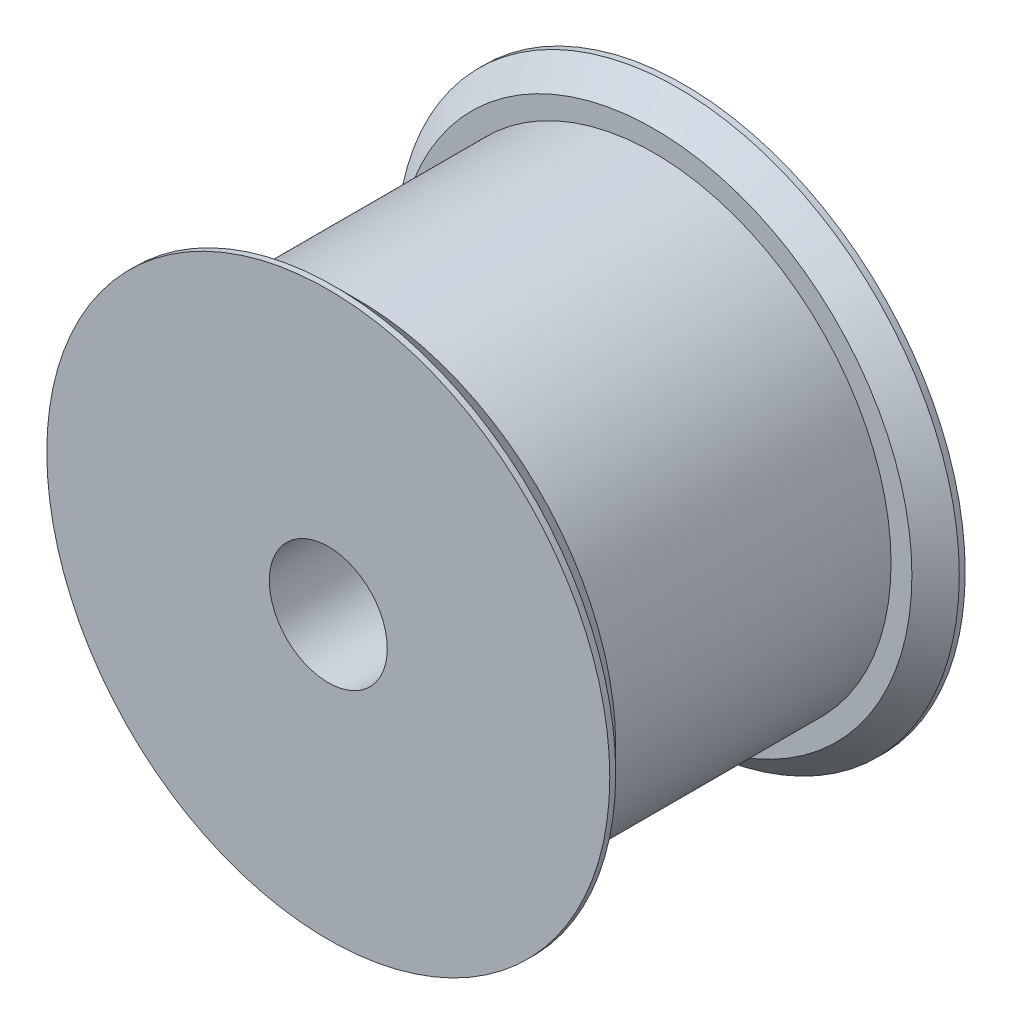
ISO-10303-21;
HEADER;
FILE_DESCRIPTION(('STEP AP214'),'2;1');
FILE_NAME('part.step','',(''),(''),'','','');
FILE_SCHEMA(('AUTOMOTIVE_DESIGN { 1 0 10303 214 1 1 1 1 }'));
ENDSEC;
DATA;
#1=APPLICATION_CONTEXT('core data for automotive mechanical design processes');
#2=APPLICATION_PROTOCOL_DEFINITION('international standard','automotive_design',2000,#1);
#3=PRODUCT_CONTEXT('',#1,'mechanical');
#4=PRODUCT('Part','Part','',(#3));
#5=PRODUCT_RELATED_PRODUCT_CATEGORY('part','',(#4));
#6=PRODUCT_DEFINITION_FORMATION('','',#4);
#7=PRODUCT_DEFINITION_CONTEXT('part definition',#1,'design');
#8=PRODUCT_DEFINITION('design','',#6,#7);
#9=PRODUCT_DEFINITION_SHAPE('','',#8);
#10=(LENGTH_UNIT() NAMED_UNIT(*) SI_UNIT(.MILLI.,.METRE.));
#11=(NAMED_UNIT(*) PLANE_ANGLE_UNIT() SI_UNIT($,.RADIAN.));
#12=(NAMED_UNIT(*) SI_UNIT($,.STERADIAN.) SOLID_ANGLE_UNIT());
#13=UNCERTAINTY_MEASURE_WITH_UNIT(LENGTH_MEASURE(1.E-05),#10,'distance_accuracy_value','');
#14=(GEOMETRIC_REPRESENTATION_CONTEXT(3) GLOBAL_UNCERTAINTY_ASSIGNED_CONTEXT((#13)) GLOBAL_UNIT_ASSIGNED_CONTEXT((#10,
#11,#12)) REPRESENTATION_CONTEXT('',''));
#15=CARTESIAN_POINT('',(0.,0.,0.));
#16=DIRECTION('',(0.,0.,1.));
#17=DIRECTION('',(1.,0.,0.));
#18=AXIS2_PLACEMENT_3D('',#15,#16,#17);
#19=CARTESIAN_POINT('',(0.,0.,12.5));
#20=DIRECTION('',(0.,0.,-1.));
#21=DIRECTION('',(-1.,0.,0.));
#22=AXIS2_PLACEMENT_3D('',#19,#20,#21);
#23=CYLINDRICAL_SURFACE('',#22,20.);
#24=CARTESIAN_POINT('',(0.,0.,12.5));
#25=DIRECTION('',(0.,0.,1.));
#26=DIRECTION('',(1.,0.,0.));
#27=AXIS2_PLACEMENT_3D('',#24,#25,#26);
#28=CIRCLE('',#27,20.);
#29=CARTESIAN_POINT('',(20.,0.,12.5));
#30=VERTEX_POINT('',#29);
#31=EDGE_CURVE('E51',#30,#30,#28,.T.);
#32=ORIENTED_EDGE('',*,*,#31,.F.);
#33=EDGE_LOOP('',(#32));
#34=FACE_BOUND('',#33,.T.);
#35=CARTESIAN_POINT('',(0.,0.,-12.5));
#36=DIRECTION('',(0.,0.,-1.));
#37=DIRECTION('',(-1.,0.,0.));
#38=AXIS2_PLACEMENT_3D('',#35,#36,#37);
#39=CIRCLE('',#38,20.);
#40=CARTESIAN_POINT('',(-20.,0.,-12.5));
#41=VERTEX_POINT('',#40);
#42=EDGE_CURVE('E57',#41,#41,#39,.T.);
#43=ORIENTED_EDGE('',*,*,#42,.F.);
#44=EDGE_LOOP('',(#43));
#45=FACE_BOUND('',#44,.T.);
#46=ADVANCED_FACE('F31',(#34,#45),#23,.T.);
#47=CARTESIAN_POINT('',(0.,0.,15.));
#48=DIRECTION('',(0.,0.,-1.));
#49=DIRECTION('',(-1.,0.,0.));
#50=AXIS2_PLACEMENT_3D('',#47,#48,#49);
#51=CYLINDRICAL_SURFACE('',#50,23.7605625347081);
#52=CARTESIAN_POINT('',(0.,0.,14.5));
#53=DIRECTION('',(0.,0.,1.));
#54=DIRECTION('',(1.,0.,0.));
#55=AXIS2_PLACEMENT_3D('',#52,#53,#54);
#56=CIRCLE('',#55,23.7605625347081);
#57=CARTESIAN_POINT('',(23.7605625347081,0.,14.5));
#58=VERTEX_POINT('',#57);
#59=EDGE_CURVE('E46',#58,#58,#56,.T.);
#60=ORIENTED_EDGE('',*,*,#59,.T.);
#61=EDGE_LOOP('',(#60));
#62=FACE_BOUND('',#61,.T.);
#63=CARTESIAN_POINT('',(0.,0.,15.));
#64=DIRECTION('',(0.,0.,1.));
#65=DIRECTION('',(1.,0.,0.));
#66=AXIS2_PLACEMENT_3D('',#63,#64,#65);
#67=CIRCLE('',#66,23.7605625347081);
#68=CARTESIAN_POINT('',(23.7605625347081,0.,15.));
#69=VERTEX_POINT('',#68);
#70=EDGE_CURVE('E54',#69,#69,#67,.T.);
#71=ORIENTED_EDGE('',*,*,#70,.F.);
#72=EDGE_LOOP('',(#71));
#73=FACE_BOUND('',#72,.T.);
#74=ADVANCED_FACE('F83',(#62,#73),#51,.T.);
#75=CARTESIAN_POINT('',(0.,0.,15.));
#76=DIRECTION('',(0.,0.,1.));
#77=DIRECTION('',(1.,0.,0.));
#78=AXIS2_PLACEMENT_3D('',#75,#76,#77);
#79=PLANE('',#78);
#80=CARTESIAN_POINT('',(0.,0.,15.));
#81=DIRECTION('',(0.,0.,1.));
#82=DIRECTION('',(1.,0.,0.));
#83=AXIS2_PLACEMENT_3D('',#80,#81,#82);
#84=CIRCLE('',#83,4.97857123421877);
#85=CARTESIAN_POINT('',(4.97857123421877,0.,15.));
#86=VERTEX_POINT('',#85);
#87=EDGE_CURVE('E64',#86,#86,#84,.T.);
#88=ORIENTED_EDGE('',*,*,#87,.F.);
#89=EDGE_LOOP('',(#88));
#90=FACE_BOUND('',#89,.T.);
#91=ORIENTED_EDGE('',*,*,#70,.T.);
#92=EDGE_LOOP('',(#91));
#93=FACE_BOUND('',#92,.T.);
#94=ADVANCED_FACE('F79',(#90,#93),#79,.T.);
#95=CARTESIAN_POINT('',(0.,0.,12.5));
#96=DIRECTION('',(0.,0.,1.));
#97=DIRECTION('',(1.,0.,0.));
#98=AXIS2_PLACEMENT_3D('',#95,#96,#97);
#99=PLANE('',#98);
#100=CARTESIAN_POINT('',(0.,0.,12.5));
#101=DIRECTION('',(0.,0.,1.));
#102=DIRECTION('',(1.,0.,0.));
#103=AXIS2_PLACEMENT_3D('',#100,#101,#102);
#104=CIRCLE('',#103,21.7605625347081);
#105=CARTESIAN_POINT('',(21.7605625347081,0.,12.5));
#106=VERTEX_POINT('',#105);
#107=EDGE_CURVE('E42',#106,#106,#104,.F.);
#108=ORIENTED_EDGE('',*,*,#107,.T.);
#109=EDGE_LOOP('',(#108));
#110=FACE_BOUND('',#109,.T.);
#111=ORIENTED_EDGE('',*,*,#31,.T.);
#112=EDGE_LOOP('',(#111));
#113=FACE_BOUND('',#112,.T.);
#114=ADVANCED_FACE('F82',(#110,#113),#99,.F.);
#115=CARTESIAN_POINT('',(0.,0.,14.5));
#116=DIRECTION('',(0.,0.,1.));
#117=DIRECTION('',(1.,0.,0.));
#118=AXIS2_PLACEMENT_3D('',#115,#116,#117);
#119=CONICAL_SURFACE('',#118,23.7605625347081,0.785398163397449);
#120=ORIENTED_EDGE('',*,*,#107,.F.);
#121=EDGE_LOOP('',(#120));
#122=FACE_BOUND('',#121,.T.);
#123=ORIENTED_EDGE('',*,*,#59,.F.);
#124=EDGE_LOOP('',(#123));
#125=FACE_BOUND('',#124,.T.);
#126=ADVANCED_FACE('F96',(#122,#125),#119,.T.);
#127=CARTESIAN_POINT('',(0.,0.,-15.));
#128=DIRECTION('',(0.,0.,1.));
#129=DIRECTION('',(1.,0.,0.));
#130=AXIS2_PLACEMENT_3D('',#127,#128,#129);
#131=CYLINDRICAL_SURFACE('',#130,23.7605625347081);
#132=CARTESIAN_POINT('',(0.,0.,-14.5));
#133=DIRECTION('',(0.,0.,-1.));
#134=DIRECTION('',(-1.,0.,0.));
#135=AXIS2_PLACEMENT_3D('',#132,#133,#134);
#136=CIRCLE('',#135,23.7605625347081);
#137=CARTESIAN_POINT('',(-23.7605625347081,0.,-14.5));
#138=VERTEX_POINT('',#137);
#139=EDGE_CURVE('E10',#138,#138,#136,.T.);
#140=ORIENTED_EDGE('',*,*,#139,.T.);
#141=EDGE_LOOP('',(#140));
#142=FACE_BOUND('',#141,.T.);
#143=CARTESIAN_POINT('',(0.,0.,-15.));
#144=DIRECTION('',(0.,0.,1.));
#145=DIRECTION('',(1.,0.,0.));
#146=AXIS2_PLACEMENT_3D('',#143,#144,#145);
#147=CIRCLE('',#146,23.7605625347081);
#148=CARTESIAN_POINT('',(23.7605625347081,0.,-15.));
#149=VERTEX_POINT('',#148);
#150=EDGE_CURVE('E60',#149,#149,#147,.T.);
#151=ORIENTED_EDGE('',*,*,#150,.T.);
#152=EDGE_LOOP('',(#151));
#153=FACE_BOUND('',#152,.T.);
#154=ADVANCED_FACE('F98',(#142,#153),#131,.T.);
#155=CARTESIAN_POINT('',(0.,0.,-15.));
#156=DIRECTION('',(0.,0.,-1.));
#157=DIRECTION('',(1.,0.,0.));
#158=AXIS2_PLACEMENT_3D('',#155,#156,#157);
#159=PLANE('',#158);
#160=CARTESIAN_POINT('',(0.,0.,-15.));
#161=DIRECTION('',(0.,0.,1.));
#162=DIRECTION('',(1.,0.,0.));
#163=AXIS2_PLACEMENT_3D('',#160,#161,#162);
#164=CIRCLE('',#163,4.97857123421877);
#165=CARTESIAN_POINT('',(4.97857123421877,0.,-15.));
#166=VERTEX_POINT('',#165);
#167=EDGE_CURVE('E63',#166,#166,#164,.T.);
#168=ORIENTED_EDGE('',*,*,#167,.T.);
#169=EDGE_LOOP('',(#168));
#170=FACE_BOUND('',#169,.T.);
#171=ORIENTED_EDGE('',*,*,#150,.F.);
#172=EDGE_LOOP('',(#171));
#173=FACE_BOUND('',#172,.T.);
#174=ADVANCED_FACE('F70',(#170,#173),#159,.T.);
#175=CARTESIAN_POINT('',(0.,0.,-12.5));
#176=DIRECTION('',(0.,0.,-1.));
#177=DIRECTION('',(1.,0.,0.));
#178=AXIS2_PLACEMENT_3D('',#175,#176,#177);
#179=PLANE('',#178);
#180=CARTESIAN_POINT('',(0.,0.,-12.5));
#181=DIRECTION('',(0.,0.,-1.));
#182=DIRECTION('',(-1.,0.,0.));
#183=AXIS2_PLACEMENT_3D('',#180,#181,#182);
#184=CIRCLE('',#183,21.7605625347081);
#185=CARTESIAN_POINT('',(-21.7605625347081,0.,-12.5));
#186=VERTEX_POINT('',#185);
#187=EDGE_CURVE('E38',#186,#186,#184,.F.);
#188=ORIENTED_EDGE('',*,*,#187,.T.);
#189=EDGE_LOOP('',(#188));
#190=FACE_BOUND('',#189,.T.);
#191=ORIENTED_EDGE('',*,*,#42,.T.);
#192=EDGE_LOOP('',(#191));
#193=FACE_BOUND('',#192,.T.);
#194=ADVANCED_FACE('F114',(#190,#193),#179,.F.);
#195=CARTESIAN_POINT('',(0.,0.,-12.5));
#196=DIRECTION('',(0.,0.,-1.));
#197=DIRECTION('',(-1.,0.,0.));
#198=AXIS2_PLACEMENT_3D('',#195,#196,#197);
#199=CONICAL_SURFACE('',#198,21.7605625347081,0.785398163397454);
#200=ORIENTED_EDGE('',*,*,#139,.F.);
#201=EDGE_LOOP('',(#200));
#202=FACE_BOUND('',#201,.T.);
#203=ORIENTED_EDGE('',*,*,#187,.F.);
#204=EDGE_LOOP('',(#203));
#205=FACE_BOUND('',#204,.T.);
#206=ADVANCED_FACE('F33',(#202,#205),#199,.T.);
#207=CARTESIAN_POINT('',(0.,0.,-15.));
#208=DIRECTION('',(0.,0.,1.));
#209=DIRECTION('',(1.,0.,0.));
#210=AXIS2_PLACEMENT_3D('',#207,#208,#209);
#211=CYLINDRICAL_SURFACE('',#210,4.97857123421877);
#212=CARTESIAN_POINT('',(4.97857123421877,0.,-15.));
#213=CARTESIAN_POINT('',(4.97857123421877,0.,-14.6875));
#214=CARTESIAN_POINT('',(4.97857123421877,0.,-14.375));
#215=CARTESIAN_POINT('',(4.97857123421877,0.,-13.75));
#216=CARTESIAN_POINT('',(4.97857123421877,0.,-13.4375));
#217=CARTESIAN_POINT('',(4.97857123421877,0.,-12.8125));
#218=CARTESIAN_POINT('',(4.97857123421877,0.,-12.5));
#219=CARTESIAN_POINT('',(4.97857123421877,0.,-11.875));
#220=CARTESIAN_POINT('',(4.97857123421877,0.,-11.5625));
#221=CARTESIAN_POINT('',(4.97857123421877,0.,-10.9375));
#222=CARTESIAN_POINT('',(4.97857123421877,0.,-10.625));
#223=CARTESIAN_POINT('',(4.97857123421877,0.,-10.));
#224=CARTESIAN_POINT('',(4.97857123421877,0.,-9.6875));
#225=CARTESIAN_POINT('',(4.97857123421877,0.,-9.0625));
#226=CARTESIAN_POINT('',(4.97857123421877,0.,-8.75));
#227=CARTESIAN_POINT('',(4.97857123421877,0.,-8.125));
#228=CARTESIAN_POINT('',(4.97857123421877,0.,-7.8125));
#229=CARTESIAN_POINT('',(4.97857123421877,0.,-7.1875));
#230=CARTESIAN_POINT('',(4.97857123421877,0.,-6.875));
#231=CARTESIAN_POINT('',(4.97857123421877,0.,-6.25));
#232=CARTESIAN_POINT('',(4.97857123421877,0.,-5.9375));
#233=CARTESIAN_POINT('',(4.97857123421877,0.,-5.3125));
#234=CARTESIAN_POINT('',(4.97857123421877,0.,-5.));
#235=CARTESIAN_POINT('',(4.97857123421877,0.,-4.375));
#236=CARTESIAN_POINT('',(4.97857123421877,0.,-4.0625));
#237=CARTESIAN_POINT('',(4.97857123421877,0.,-3.4375));
#238=CARTESIAN_POINT('',(4.97857123421877,0.,-3.125));
#239=CARTESIAN_POINT('',(4.97857123421877,0.,-2.5));
#240=CARTESIAN_POINT('',(4.97857123421877,0.,-2.1875));
#241=CARTESIAN_POINT('',(4.97857123421877,0.,-1.5625));
#242=CARTESIAN_POINT('',(4.97857123421877,0.,-1.25));
#243=CARTESIAN_POINT('',(4.97857123421877,0.,-0.625000000000002));
#244=CARTESIAN_POINT('',(4.97857123421877,0.,-0.312500000000002));
#245=CARTESIAN_POINT('',(4.97857123421877,0.,0.312499999999999));
#246=CARTESIAN_POINT('',(4.97857123421877,0.,0.624999999999999));
#247=CARTESIAN_POINT('',(4.97857123421877,0.,1.25));
#248=CARTESIAN_POINT('',(4.97857123421877,0.,1.5625));
#249=CARTESIAN_POINT('',(4.97857123421877,0.,2.1875));
#250=CARTESIAN_POINT('',(4.97857123421877,0.,2.5));
#251=CARTESIAN_POINT('',(4.97857123421877,0.,3.125));
#252=CARTESIAN_POINT('',(4.97857123421877,0.,3.4375));
#253=CARTESIAN_POINT('',(4.97857123421877,0.,4.0625));
#254=CARTESIAN_POINT('',(4.97857123421877,0.,4.375));
#255=CARTESIAN_POINT('',(4.97857123421877,0.,5.));
#256=CARTESIAN_POINT('',(4.97857123421877,0.,5.3125));
#257=CARTESIAN_POINT('',(4.97857123421877,0.,5.9375));
#258=CARTESIAN_POINT('',(4.97857123421877,0.,6.25));
#259=CARTESIAN_POINT('',(4.97857123421877,0.,6.875));
#260=CARTESIAN_POINT('',(4.97857123421877,0.,7.1875));
#261=CARTESIAN_POINT('',(4.97857123421877,0.,7.8125));
#262=CARTESIAN_POINT('',(4.97857123421877,0.,8.125));
#263=CARTESIAN_POINT('',(4.97857123421877,0.,8.75));
#264=CARTESIAN_POINT('',(4.97857123421877,0.,9.0625));
#265=CARTESIAN_POINT('',(4.97857123421877,0.,9.6875));
#266=CARTESIAN_POINT('',(4.97857123421877,0.,10.));
#267=CARTESIAN_POINT('',(4.97857123421877,0.,10.625));
#268=CARTESIAN_POINT('',(4.97857123421877,0.,10.9375));
#269=CARTESIAN_POINT('',(4.97857123421877,0.,11.5625));
#270=CARTESIAN_POINT('',(4.97857123421877,0.,11.875));
#271=CARTESIAN_POINT('',(4.97857123421877,0.,12.5));
#272=CARTESIAN_POINT('',(4.97857123421877,0.,12.8125));
#273=CARTESIAN_POINT('',(4.97857123421877,0.,13.4375));
#274=CARTESIAN_POINT('',(4.97857123421877,0.,13.75));
#275=CARTESIAN_POINT('',(4.97857123421877,0.,14.375));
#276=CARTESIAN_POINT('',(4.97857123421877,0.,14.6875));
#277=CARTESIAN_POINT('',(4.97857123421877,0.,15.));
#278=B_SPLINE_CURVE_WITH_KNOTS('',3,(#212,#213,#214,#215,#216,#217,#218,#219,#220,#221,#222,
#223,#224,#225,#226,#227,#228,#229,#230,#231,#232,#233,#234,#235,#236,#237,#238,#239,#240,#241,
#242,#243,#244,#245,#246,#247,#248,#249,#250,#251,#252,#253,#254,#255,#256,#257,#258,#259,#260,
#261,#262,#263,#264,#265,#266,#267,#268,#269,#270,#271,#272,#273,#274,#275,#276,#277),
.UNSPECIFIED.,.F.,.F.,(4,2,2,2,2,2,2,2,2,2,2,2,2,2,2,2,2,2,2,2,2,2,2,2,2,2,2,2,2,2,2,2,4),(0.,
0.937500000000001,1.875,2.8125,3.75,4.6875,5.625,6.5625,7.5,8.4375,9.375,10.3125,11.25,12.1875,
13.125,14.0625,15.,15.9375,16.875,17.8125,18.75,19.6875,20.625,21.5625,22.5,23.4375,24.375,
25.3125,26.25,27.1875,28.125,29.0625,30.),.UNSPECIFIED.);
#279=EDGE_CURVE('BSEAM73',#166,#86,#278,.T.);
#280=ORIENTED_EDGE('',*,*,#167,.F.);
#281=ORIENTED_EDGE('',*,*,#87,.T.);
#282=ORIENTED_EDGE('',*,*,#279,.T.);
#283=ORIENTED_EDGE('',*,*,#279,.F.);
#284=EDGE_LOOP('',(#280,#282,#281,#283));
#285=FACE_BOUND('',#284,.T.);
#286=ADVANCED_FACE('F73',(#285),#211,.F.);
#287=CLOSED_SHELL('',(#46,#74,#94,#114,#126,#154,#174,#194,#206,#286));
#288=MANIFOLD_SOLID_BREP('B2',#287);
#289=ADVANCED_BREP_SHAPE_REPRESENTATION('',(#18,#288),#14);
#290=SHAPE_DEFINITION_REPRESENTATION(#9,#289);
ENDSEC;
END-ISO-10303-21;
